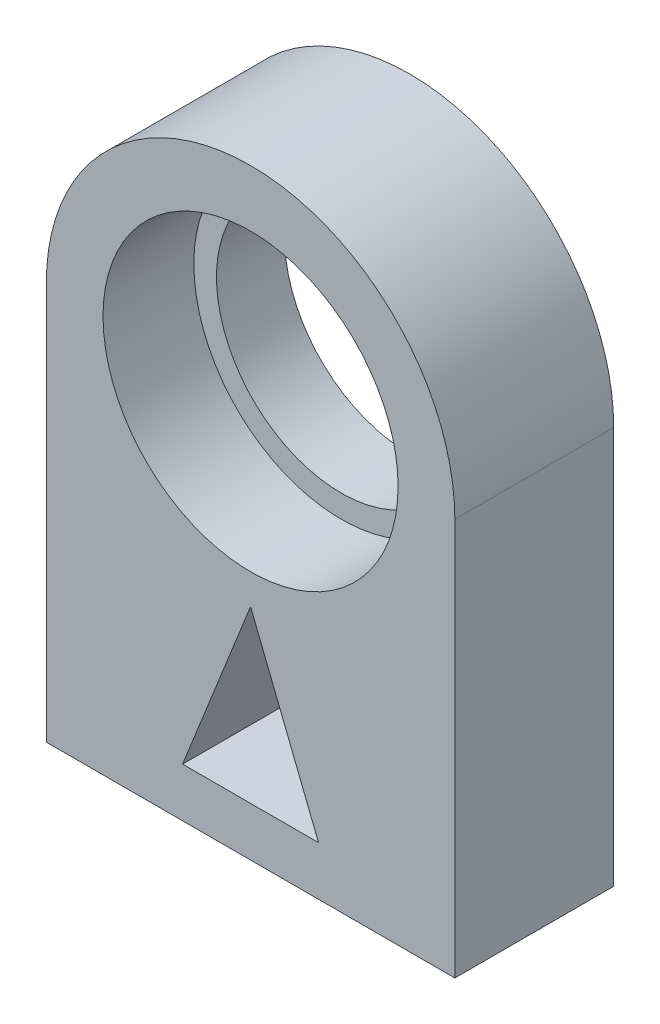
ISO-10303-21;
HEADER;
FILE_DESCRIPTION(('STEP AP214'),'2;1');
FILE_NAME('part.step','',(''),(''),'','','');
FILE_SCHEMA(('AUTOMOTIVE_DESIGN { 1 0 10303 214 1 1 1 1 }'));
ENDSEC;
DATA;
#1=APPLICATION_CONTEXT('core data for automotive mechanical design processes');
#2=APPLICATION_PROTOCOL_DEFINITION('international standard','automotive_design',2000,#1);
#3=PRODUCT_CONTEXT('',#1,'mechanical');
#4=PRODUCT('Part','Part','',(#3));
#5=PRODUCT_RELATED_PRODUCT_CATEGORY('part','',(#4));
#6=PRODUCT_DEFINITION_FORMATION('','',#4);
#7=PRODUCT_DEFINITION_CONTEXT('part definition',#1,'design');
#8=PRODUCT_DEFINITION('design','',#6,#7);
#9=PRODUCT_DEFINITION_SHAPE('','',#8);
#10=(LENGTH_UNIT() NAMED_UNIT(*) SI_UNIT(.MILLI.,.METRE.));
#11=(NAMED_UNIT(*) PLANE_ANGLE_UNIT() SI_UNIT($,.RADIAN.));
#12=(NAMED_UNIT(*) SI_UNIT($,.STERADIAN.) SOLID_ANGLE_UNIT());
#13=UNCERTAINTY_MEASURE_WITH_UNIT(LENGTH_MEASURE(1.E-05),#10,'distance_accuracy_value','');
#14=(GEOMETRIC_REPRESENTATION_CONTEXT(3) GLOBAL_UNCERTAINTY_ASSIGNED_CONTEXT((#13)) GLOBAL_UNIT_ASSIGNED_CONTEXT((#10,
#11,#12)) REPRESENTATION_CONTEXT('',''));
#15=CARTESIAN_POINT('',(0.,0.,0.));
#16=DIRECTION('',(0.,0.,1.));
#17=DIRECTION('',(1.,0.,0.));
#18=AXIS2_PLACEMENT_3D('',#15,#16,#17);
#19=CARTESIAN_POINT('',(0.,0.,7.));
#20=DIRECTION('',(0.,0.,1.));
#21=DIRECTION('',(1.,0.,0.));
#22=AXIS2_PLACEMENT_3D('',#19,#20,#21);
#23=PLANE('',#22);
#24=CARTESIAN_POINT('',(9.,18.,7.));
#25=DIRECTION('',(0.,0.,1.));
#26=DIRECTION('',(1.,0.,0.));
#27=AXIS2_PLACEMENT_3D('',#24,#25,#26);
#28=CIRCLE('',#27,6.5);
#29=CARTESIAN_POINT('',(15.5,18.,7.));
#30=VERTEX_POINT('',#29);
#31=EDGE_CURVE('E144',#30,#30,#28,.T.);
#32=ORIENTED_EDGE('',*,*,#31,.F.);
#33=EDGE_LOOP('',(#32));
#34=FACE_BOUND('',#33,.T.);
#35=DIRECTION('',(0.,1.,0.));
#36=VECTOR('',#35,1.);
#37=CARTESIAN_POINT('',(0.,0.,7.));
#38=LINE('',#37,#36);
#39=CARTESIAN_POINT('',(0.,0.5,7.));
#40=VERTEX_POINT('',#39);
#41=CARTESIAN_POINT('',(0.,18.,7.));
#42=VERTEX_POINT('',#41);
#43=EDGE_CURVE('E161',#40,#42,#38,.T.);
#44=ORIENTED_EDGE('',*,*,#43,.F.);
#45=DIRECTION('',(-1.,0.,0.));
#46=VECTOR('',#45,1.);
#47=CARTESIAN_POINT('',(18.,0.5,7.));
#48=LINE('',#47,#46);
#49=CARTESIAN_POINT('',(18.,0.5,7.));
#50=VERTEX_POINT('',#49);
#51=EDGE_CURVE('E135',#50,#40,#48,.T.);
#52=ORIENTED_EDGE('',*,*,#51,.F.);
#53=DIRECTION('',(0.,1.,0.));
#54=VECTOR('',#53,1.);
#55=CARTESIAN_POINT('',(18.,0.,7.));
#56=LINE('',#55,#54);
#57=CARTESIAN_POINT('',(18.,18.,7.));
#58=VERTEX_POINT('',#57);
#59=EDGE_CURVE('E164',#50,#58,#56,.T.);
#60=ORIENTED_EDGE('',*,*,#59,.T.);
#61=CARTESIAN_POINT('',(9.,18.,7.));
#62=DIRECTION('',(0.,0.,1.));
#63=DIRECTION('',(1.,0.,0.));
#64=AXIS2_PLACEMENT_3D('',#61,#62,#63);
#65=CIRCLE('',#64,9.);
#66=EDGE_CURVE('E158',#58,#42,#65,.T.);
#67=ORIENTED_EDGE('',*,*,#66,.T.);
#68=EDGE_LOOP('',(#44,#52,#60,#67));
#69=FACE_BOUND('',#68,.T.);
#70=DIRECTION('',(1.,0.,0.));
#71=VECTOR('',#70,1.);
#72=CARTESIAN_POINT('',(0.,2.66294546498915,7.));
#73=LINE('',#72,#71);
#74=CARTESIAN_POINT('',(6.00458727314255,2.66294546498915,7.));
#75=VERTEX_POINT('',#74);
#76=CARTESIAN_POINT('',(11.9954127268574,2.66294546498915,7.));
#77=VERTEX_POINT('',#76);
#78=EDGE_CURVE('E111',#75,#77,#73,.T.);
#79=ORIENTED_EDGE('',*,*,#78,.F.);
#80=DIRECTION('',(0.370591335929602,0.928796028056706,0.));
#81=VECTOR('',#80,1.);
#82=CARTESIAN_POINT('',(4.26333379293957,-1.7010780818529,7.));
#83=LINE('',#82,#81);
#84=CARTESIAN_POINT('',(9.,10.1702106742983,7.));
#85=VERTEX_POINT('',#84);
#86=EDGE_CURVE('E130',#75,#85,#83,.T.);
#87=ORIENTED_EDGE('',*,*,#86,.T.);
#88=DIRECTION('',(0.370591335929602,-0.928796028056706,0.));
#89=VECTOR('',#88,1.);
#90=CARTESIAN_POINT('',(11.2645833182709,4.49458961333267,7.));
#91=LINE('',#90,#89);
#92=EDGE_CURVE('E126',#85,#77,#91,.T.);
#93=ORIENTED_EDGE('',*,*,#92,.T.);
#94=EDGE_LOOP('',(#79,#87,#93));
#95=FACE_BOUND('',#94,.T.);
#96=ADVANCED_FACE('F45',(#34,#69,#95),#23,.T.);
#97=CARTESIAN_POINT('',(0.,0.,0.));
#98=DIRECTION('',(0.,0.,1.));
#99=DIRECTION('',(1.,0.,0.));
#100=AXIS2_PLACEMENT_3D('',#97,#98,#99);
#101=PLANE('',#100);
#102=DIRECTION('',(1.,0.,0.));
#103=VECTOR('',#102,1.);
#104=CARTESIAN_POINT('',(18.,0.5,0.));
#105=LINE('',#104,#103);
#106=CARTESIAN_POINT('',(0.,0.5,0.));
#107=VERTEX_POINT('',#106);
#108=CARTESIAN_POINT('',(18.,0.5,0.));
#109=VERTEX_POINT('',#108);
#110=EDGE_CURVE('E139',#107,#109,#105,.T.);
#111=ORIENTED_EDGE('',*,*,#110,.F.);
#112=DIRECTION('',(0.,1.,0.));
#113=VECTOR('',#112,1.);
#114=CARTESIAN_POINT('',(0.,0.,0.));
#115=LINE('',#114,#113);
#116=CARTESIAN_POINT('',(0.,18.,0.));
#117=VERTEX_POINT('',#116);
#118=EDGE_CURVE('E171',#107,#117,#115,.T.);
#119=ORIENTED_EDGE('',*,*,#118,.T.);
#120=CARTESIAN_POINT('',(9.,18.,0.));
#121=DIRECTION('',(0.,0.,1.));
#122=DIRECTION('',(1.,0.,0.));
#123=AXIS2_PLACEMENT_3D('',#120,#121,#122);
#124=CIRCLE('',#123,9.);
#125=CARTESIAN_POINT('',(18.,18.,0.));
#126=VERTEX_POINT('',#125);
#127=EDGE_CURVE('E168',#126,#117,#124,.T.);
#128=ORIENTED_EDGE('',*,*,#127,.F.);
#129=DIRECTION('',(0.,1.,0.));
#130=VECTOR('',#129,1.);
#131=CARTESIAN_POINT('',(18.,0.,0.));
#132=LINE('',#131,#130);
#133=EDGE_CURVE('E162',#109,#126,#132,.T.);
#134=ORIENTED_EDGE('',*,*,#133,.F.);
#135=EDGE_LOOP('',(#111,#119,#128,#134));
#136=FACE_BOUND('',#135,.T.);
#137=CARTESIAN_POINT('',(9.,18.,0.));
#138=DIRECTION('',(0.,0.,1.));
#139=DIRECTION('',(1.,0.,0.));
#140=AXIS2_PLACEMENT_3D('',#137,#138,#139);
#141=CIRCLE('',#140,5.5);
#142=CARTESIAN_POINT('',(14.5,18.,0.));
#143=VERTEX_POINT('',#142);
#144=EDGE_CURVE('E154',#143,#143,#141,.T.);
#145=ORIENTED_EDGE('',*,*,#144,.T.);
#146=EDGE_LOOP('',(#145));
#147=FACE_BOUND('',#146,.T.);
#148=DIRECTION('',(-0.370591335929602,-0.928796028056706,0.));
#149=VECTOR('',#148,1.);
#150=CARTESIAN_POINT('',(4.26333379293957,-1.7010780818529,0.));
#151=LINE('',#150,#149);
#152=CARTESIAN_POINT('',(9.,10.1702106742983,0.));
#153=VERTEX_POINT('',#152);
#154=CARTESIAN_POINT('',(6.00458727314255,2.66294546498915,0.));
#155=VERTEX_POINT('',#154);
#156=EDGE_CURVE('E70',#153,#155,#151,.T.);
#157=ORIENTED_EDGE('',*,*,#156,.T.);
#158=DIRECTION('',(-1.,0.,0.));
#159=VECTOR('',#158,1.);
#160=CARTESIAN_POINT('',(0.,2.66294546498915,0.));
#161=LINE('',#160,#159);
#162=CARTESIAN_POINT('',(11.9954127268574,2.66294546498915,0.));
#163=VERTEX_POINT('',#162);
#164=EDGE_CURVE('E109',#163,#155,#161,.T.);
#165=ORIENTED_EDGE('',*,*,#164,.F.);
#166=DIRECTION('',(-0.370591335929602,0.928796028056706,0.));
#167=VECTOR('',#166,1.);
#168=CARTESIAN_POINT('',(11.2645833182709,4.49458961333267,0.));
#169=LINE('',#168,#167);
#170=EDGE_CURVE('E117',#163,#153,#169,.T.);
#171=ORIENTED_EDGE('',*,*,#170,.T.);
#172=EDGE_LOOP('',(#157,#165,#171));
#173=FACE_BOUND('',#172,.T.);
#174=ADVANCED_FACE('F121',(#136,#147,#173),#101,.F.);
#175=CARTESIAN_POINT('',(0.,0.,7.));
#176=DIRECTION('',(-1.,0.,0.));
#177=DIRECTION('',(0.,0.,1.));
#178=AXIS2_PLACEMENT_3D('',#175,#176,#177);
#179=PLANE('',#178);
#180=ORIENTED_EDGE('',*,*,#118,.F.);
#181=DIRECTION('',(0.,0.,-1.));
#182=VECTOR('',#181,1.);
#183=CARTESIAN_POINT('',(0.,0.5,0.));
#184=LINE('',#183,#182);
#185=EDGE_CURVE('E137',#40,#107,#184,.T.);
#186=ORIENTED_EDGE('',*,*,#185,.F.);
#187=ORIENTED_EDGE('',*,*,#43,.T.);
#188=DIRECTION('',(0.,0.,-1.));
#189=VECTOR('',#188,1.);
#190=CARTESIAN_POINT('',(0.,18.,7.));
#191=LINE('',#190,#189);
#192=EDGE_CURVE('E11',#42,#117,#191,.T.);
#193=ORIENTED_EDGE('',*,*,#192,.T.);
#194=EDGE_LOOP('',(#180,#186,#187,#193));
#195=FACE_BOUND('',#194,.T.);
#196=ADVANCED_FACE('F229',(#195),#179,.T.);
#197=CARTESIAN_POINT('',(18.,0.,7.));
#198=DIRECTION('',(-1.,0.,0.));
#199=DIRECTION('',(0.,0.,1.));
#200=AXIS2_PLACEMENT_3D('',#197,#198,#199);
#201=PLANE('',#200);
#202=DIRECTION('',(0.,0.,1.));
#203=VECTOR('',#202,1.);
#204=CARTESIAN_POINT('',(18.,0.5,0.));
#205=LINE('',#204,#203);
#206=EDGE_CURVE('E133',#109,#50,#205,.T.);
#207=ORIENTED_EDGE('',*,*,#206,.F.);
#208=ORIENTED_EDGE('',*,*,#133,.T.);
#209=DIRECTION('',(0.,0.,-1.));
#210=VECTOR('',#209,1.);
#211=CARTESIAN_POINT('',(18.,18.,7.));
#212=LINE('',#211,#210);
#213=EDGE_CURVE('E54',#58,#126,#212,.T.);
#214=ORIENTED_EDGE('',*,*,#213,.F.);
#215=ORIENTED_EDGE('',*,*,#59,.F.);
#216=EDGE_LOOP('',(#207,#208,#214,#215));
#217=FACE_BOUND('',#216,.T.);
#218=ADVANCED_FACE('F231',(#217),#201,.F.);
#219=CARTESIAN_POINT('',(9.,18.,7.));
#220=DIRECTION('',(0.,0.,-1.));
#221=DIRECTION('',(-1.,0.,0.));
#222=AXIS2_PLACEMENT_3D('',#219,#220,#221);
#223=CYLINDRICAL_SURFACE('',#222,5.5);
#224=ORIENTED_EDGE('',*,*,#144,.F.);
#225=EDGE_LOOP('',(#224));
#226=FACE_BOUND('',#225,.T.);
#227=CARTESIAN_POINT('',(9.,18.,3.));
#228=DIRECTION('',(0.,0.,1.));
#229=DIRECTION('',(1.,0.,0.));
#230=AXIS2_PLACEMENT_3D('',#227,#228,#229);
#231=CIRCLE('',#230,5.5);
#232=CARTESIAN_POINT('',(14.5,18.,3.));
#233=VERTEX_POINT('',#232);
#234=EDGE_CURVE('E148',#233,#233,#231,.T.);
#235=ORIENTED_EDGE('',*,*,#234,.T.);
#236=EDGE_LOOP('',(#235));
#237=FACE_BOUND('',#236,.T.);
#238=ADVANCED_FACE('F47',(#226,#237),#223,.F.);
#239=CARTESIAN_POINT('',(9.,18.,7.));
#240=DIRECTION('',(0.,0.,-1.));
#241=DIRECTION('',(-1.,0.,0.));
#242=AXIS2_PLACEMENT_3D('',#239,#240,#241);
#243=CYLINDRICAL_SURFACE('',#242,9.);
#244=ORIENTED_EDGE('',*,*,#127,.T.);
#245=ORIENTED_EDGE('',*,*,#192,.F.);
#246=ORIENTED_EDGE('',*,*,#66,.F.);
#247=ORIENTED_EDGE('',*,*,#213,.T.);
#248=EDGE_LOOP('',(#244,#245,#246,#247));
#249=FACE_BOUND('',#248,.T.);
#250=ADVANCED_FACE('F189',(#249),#243,.T.);
#251=CARTESIAN_POINT('',(9.,18.,3.));
#252=DIRECTION('',(0.,0.,1.));
#253=DIRECTION('',(1.,0.,0.));
#254=AXIS2_PLACEMENT_3D('',#251,#252,#253);
#255=CYLINDRICAL_SURFACE('',#254,6.5);
#256=CARTESIAN_POINT('',(9.,18.,3.));
#257=DIRECTION('',(0.,0.,1.));
#258=DIRECTION('',(1.,0.,0.));
#259=AXIS2_PLACEMENT_3D('',#256,#257,#258);
#260=CIRCLE('',#259,6.5);
#261=CARTESIAN_POINT('',(15.5,18.,3.));
#262=VERTEX_POINT('',#261);
#263=EDGE_CURVE('E145',#262,#262,#260,.T.);
#264=ORIENTED_EDGE('',*,*,#263,.F.);
#265=EDGE_LOOP('',(#264));
#266=FACE_BOUND('',#265,.T.);
#267=ORIENTED_EDGE('',*,*,#31,.T.);
#268=EDGE_LOOP('',(#267));
#269=FACE_BOUND('',#268,.T.);
#270=ADVANCED_FACE('F183',(#266,#269),#255,.F.);
#271=CARTESIAN_POINT('',(9.,18.,3.));
#272=DIRECTION('',(0.,0.,1.));
#273=DIRECTION('',(1.,0.,0.));
#274=AXIS2_PLACEMENT_3D('',#271,#272,#273);
#275=PLANE('',#274);
#276=ORIENTED_EDGE('',*,*,#234,.F.);
#277=EDGE_LOOP('',(#276));
#278=FACE_BOUND('',#277,.T.);
#279=ORIENTED_EDGE('',*,*,#263,.T.);
#280=EDGE_LOOP('',(#279));
#281=FACE_BOUND('',#280,.T.);
#282=ADVANCED_FACE('F179',(#278,#281),#275,.T.);
#283=CARTESIAN_POINT('',(0.,0.5,0.));
#284=DIRECTION('',(0.,-1.,0.));
#285=DIRECTION('',(0.,0.,-1.));
#286=AXIS2_PLACEMENT_3D('',#283,#284,#285);
#287=PLANE('',#286);
#288=ORIENTED_EDGE('',*,*,#206,.T.);
#289=ORIENTED_EDGE('',*,*,#51,.T.);
#290=ORIENTED_EDGE('',*,*,#185,.T.);
#291=ORIENTED_EDGE('',*,*,#110,.T.);
#292=EDGE_LOOP('',(#288,#289,#290,#291));
#293=FACE_BOUND('',#292,.T.);
#294=CARTESIAN_POINT('',(15.,0.5,3.5));
#295=DIRECTION('',(0.,-1.,0.));
#296=DIRECTION('',(0.,0.,-1.));
#297=AXIS2_PLACEMENT_3D('',#294,#295,#296);
#298=CIRCLE('',#297,1.25);
#299=CARTESIAN_POINT('',(15.,0.5,2.25));
#300=VERTEX_POINT('',#299);
#301=EDGE_CURVE('E49',#300,#300,#298,.F.);
#302=ORIENTED_EDGE('',*,*,#301,.T.);
#303=EDGE_LOOP('',(#302));
#304=FACE_BOUND('',#303,.T.);
#305=CARTESIAN_POINT('',(3.,0.5,3.5));
#306=DIRECTION('',(0.,-1.,0.));
#307=DIRECTION('',(0.,0.,-1.));
#308=AXIS2_PLACEMENT_3D('',#305,#306,#307);
#309=CIRCLE('',#308,1.25);
#310=CARTESIAN_POINT('',(3.,0.5,2.25));
#311=VERTEX_POINT('',#310);
#312=EDGE_CURVE('E141',#311,#311,#309,.F.);
#313=ORIENTED_EDGE('',*,*,#312,.T.);
#314=EDGE_LOOP('',(#313));
#315=FACE_BOUND('',#314,.T.);
#316=ADVANCED_FACE('F182',(#293,#304,#315),#287,.T.);
#317=CARTESIAN_POINT('',(3.,12.,3.5));
#318=DIRECTION('',(0.,-1.,0.));
#319=DIRECTION('',(0.,0.,-1.));
#320=AXIS2_PLACEMENT_3D('',#317,#318,#319);
#321=PLANE('',#320);
#322=CARTESIAN_POINT('',(3.,12.,3.5));
#323=DIRECTION('',(0.,-1.,0.));
#324=DIRECTION('',(0.,0.,-1.));
#325=AXIS2_PLACEMENT_3D('',#322,#323,#324);
#326=CIRCLE('',#325,1.25);
#327=CARTESIAN_POINT('',(3.,12.,2.25));
#328=VERTEX_POINT('',#327);
#329=EDGE_CURVE('E155',#328,#328,#326,.T.);
#330=ORIENTED_EDGE('',*,*,#329,.T.);
#331=EDGE_LOOP('',(#330));
#332=FACE_BOUND('',#331,.T.);
#333=ADVANCED_FACE('F214',(#332),#321,.T.);
#334=CARTESIAN_POINT('',(3.,12.,3.5));
#335=DIRECTION('',(0.,-1.,0.));
#336=DIRECTION('',(0.,0.,-1.));
#337=AXIS2_PLACEMENT_3D('',#334,#335,#336);
#338=CYLINDRICAL_SURFACE('',#337,1.25);
#339=ORIENTED_EDGE('',*,*,#329,.F.);
#340=EDGE_LOOP('',(#339));
#341=FACE_BOUND('',#340,.T.);
#342=ORIENTED_EDGE('',*,*,#312,.F.);
#343=EDGE_LOOP('',(#342));
#344=FACE_BOUND('',#343,.T.);
#345=ADVANCED_FACE('F218',(#341,#344),#338,.F.);
#346=CARTESIAN_POINT('',(15.,12.,3.5));
#347=DIRECTION('',(0.,-1.,0.));
#348=DIRECTION('',(0.,0.,-1.));
#349=AXIS2_PLACEMENT_3D('',#346,#347,#348);
#350=PLANE('',#349);
#351=CARTESIAN_POINT('',(15.,12.,3.5));
#352=DIRECTION('',(0.,-1.,0.));
#353=DIRECTION('',(0.,0.,-1.));
#354=AXIS2_PLACEMENT_3D('',#351,#352,#353);
#355=CIRCLE('',#354,1.25);
#356=CARTESIAN_POINT('',(15.,12.,2.25));
#357=VERTEX_POINT('',#356);
#358=EDGE_CURVE('E151',#357,#357,#355,.T.);
#359=ORIENTED_EDGE('',*,*,#358,.T.);
#360=EDGE_LOOP('',(#359));
#361=FACE_BOUND('',#360,.T.);
#362=ADVANCED_FACE('F208',(#361),#350,.T.);
#363=CARTESIAN_POINT('',(15.,12.,3.5));
#364=DIRECTION('',(0.,-1.,0.));
#365=DIRECTION('',(0.,0.,-1.));
#366=AXIS2_PLACEMENT_3D('',#363,#364,#365);
#367=CYLINDRICAL_SURFACE('',#366,1.25);
#368=ORIENTED_EDGE('',*,*,#358,.F.);
#369=EDGE_LOOP('',(#368));
#370=FACE_BOUND('',#369,.T.);
#371=ORIENTED_EDGE('',*,*,#301,.F.);
#372=EDGE_LOOP('',(#371));
#373=FACE_BOUND('',#372,.T.);
#374=ADVANCED_FACE('F201',(#370,#373),#367,.F.);
#375=CARTESIAN_POINT('',(4.26333379293957,-1.7010780818529,10.));
#376=DIRECTION('',(0.928796028056706,-0.370591335929602,0.));
#377=DIRECTION('',(0.370591335929602,0.928796028056706,0.));
#378=AXIS2_PLACEMENT_3D('',#375,#376,#377);
#379=PLANE('',#378);
#380=DIRECTION('',(0.,0.,-1.));
#381=VECTOR('',#380,1.);
#382=CARTESIAN_POINT('',(6.00458727314255,2.66294546498915,10.));
#383=LINE('',#382,#381);
#384=EDGE_CURVE('E113',#75,#155,#383,.T.);
#385=ORIENTED_EDGE('',*,*,#384,.T.);
#386=ORIENTED_EDGE('',*,*,#156,.F.);
#387=DIRECTION('',(0.,0.,-1.));
#388=VECTOR('',#387,1.);
#389=CARTESIAN_POINT('',(9.,10.1702106742983,10.));
#390=LINE('',#389,#388);
#391=EDGE_CURVE('E114',#85,#153,#390,.T.);
#392=ORIENTED_EDGE('',*,*,#391,.F.);
#393=ORIENTED_EDGE('',*,*,#86,.F.);
#394=EDGE_LOOP('',(#385,#386,#392,#393));
#395=FACE_BOUND('',#394,.T.);
#396=ADVANCED_FACE('F199',(#395),#379,.T.);
#397=CARTESIAN_POINT('',(0.,2.66294546498915,10.));
#398=DIRECTION('',(0.,-1.,0.));
#399=DIRECTION('',(0.,0.,-1.));
#400=AXIS2_PLACEMENT_3D('',#397,#398,#399);
#401=PLANE('',#400);
#402=ORIENTED_EDGE('',*,*,#78,.T.);
#403=DIRECTION('',(0.,0.,-1.));
#404=VECTOR('',#403,1.);
#405=CARTESIAN_POINT('',(11.9954127268574,2.66294546498915,10.));
#406=LINE('',#405,#404);
#407=EDGE_CURVE('E62',#77,#163,#406,.T.);
#408=ORIENTED_EDGE('',*,*,#407,.T.);
#409=ORIENTED_EDGE('',*,*,#164,.T.);
#410=ORIENTED_EDGE('',*,*,#384,.F.);
#411=EDGE_LOOP('',(#402,#408,#409,#410));
#412=FACE_BOUND('',#411,.T.);
#413=ADVANCED_FACE('F106',(#412),#401,.F.);
#414=CARTESIAN_POINT('',(11.2645833182709,4.49458961333267,10.));
#415=DIRECTION('',(-0.928796028056706,-0.370591335929602,0.));
#416=DIRECTION('',(0.370591335929602,-0.928796028056706,0.));
#417=AXIS2_PLACEMENT_3D('',#414,#415,#416);
#418=PLANE('',#417);
#419=ORIENTED_EDGE('',*,*,#391,.T.);
#420=ORIENTED_EDGE('',*,*,#170,.F.);
#421=ORIENTED_EDGE('',*,*,#407,.F.);
#422=ORIENTED_EDGE('',*,*,#92,.F.);
#423=EDGE_LOOP('',(#419,#420,#421,#422));
#424=FACE_BOUND('',#423,.T.);
#425=ADVANCED_FACE('F118',(#424),#418,.T.);
#426=CLOSED_SHELL('',(#96,#174,#196,#218,#238,#250,#270,#282,#316,#333,#345,#362,#374,#396,#413,#425));
#427=MANIFOLD_SOLID_BREP('B2',#426);
#428=ADVANCED_BREP_SHAPE_REPRESENTATION('',(#18,#427),#14);
#429=SHAPE_DEFINITION_REPRESENTATION(#9,#428);
ENDSEC;
END-ISO-10303-21;
